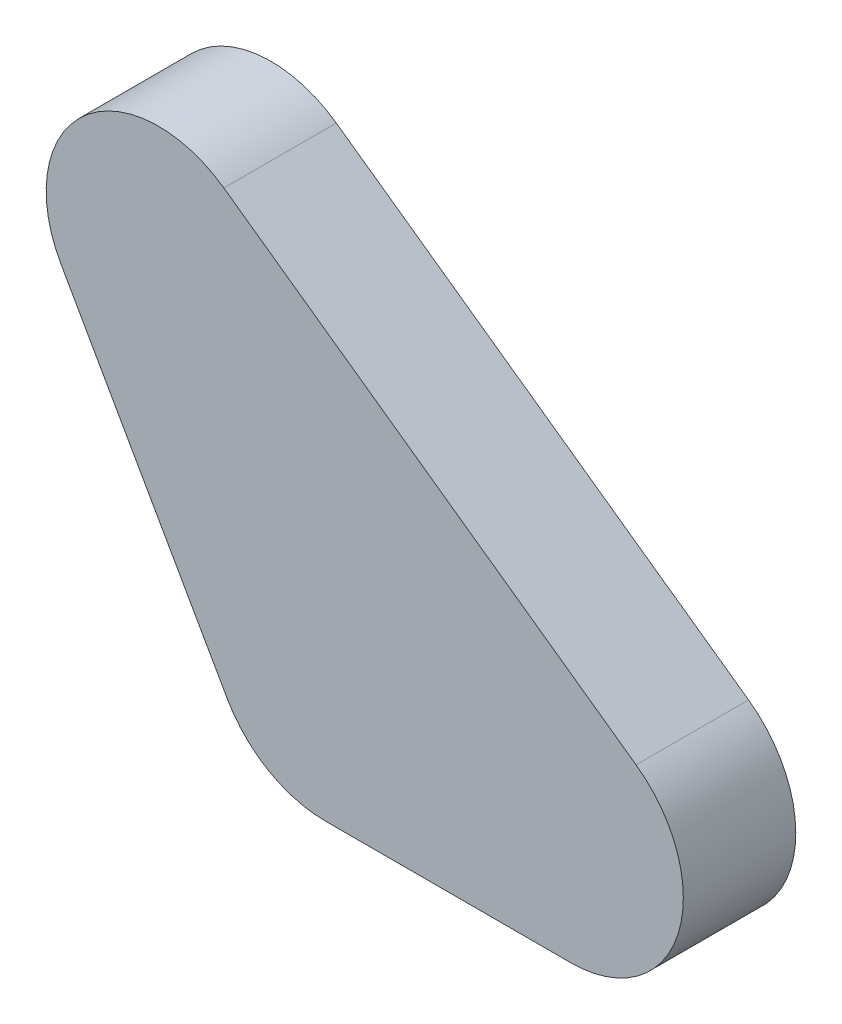
ISO-10303-21;
HEADER;
FILE_DESCRIPTION(('STEP AP214'),'2;1');
FILE_NAME('part.step','',(''),(''),'','','');
FILE_SCHEMA(('AUTOMOTIVE_DESIGN { 1 0 10303 214 1 1 1 1 }'));
ENDSEC;
DATA;
#1=APPLICATION_CONTEXT('core data for automotive mechanical design processes');
#2=APPLICATION_PROTOCOL_DEFINITION('international standard','automotive_design',2000,#1);
#3=PRODUCT_CONTEXT('',#1,'mechanical');
#4=PRODUCT('Part','Part','',(#3));
#5=PRODUCT_RELATED_PRODUCT_CATEGORY('part','',(#4));
#6=PRODUCT_DEFINITION_FORMATION('','',#4);
#7=PRODUCT_DEFINITION_CONTEXT('part definition',#1,'design');
#8=PRODUCT_DEFINITION('design','',#6,#7);
#9=PRODUCT_DEFINITION_SHAPE('','',#8);
#10=(LENGTH_UNIT() NAMED_UNIT(*) SI_UNIT(.MILLI.,.METRE.));
#11=(NAMED_UNIT(*) PLANE_ANGLE_UNIT() SI_UNIT($,.RADIAN.));
#12=(NAMED_UNIT(*) SI_UNIT($,.STERADIAN.) SOLID_ANGLE_UNIT());
#13=UNCERTAINTY_MEASURE_WITH_UNIT(LENGTH_MEASURE(1.E-05),#10,'distance_accuracy_value','');
#14=(GEOMETRIC_REPRESENTATION_CONTEXT(3) GLOBAL_UNCERTAINTY_ASSIGNED_CONTEXT((#13)) GLOBAL_UNIT_ASSIGNED_CONTEXT((#10,
#11,#12)) REPRESENTATION_CONTEXT('',''));
#15=CARTESIAN_POINT('',(0.,0.,0.));
#16=DIRECTION('',(0.,0.,1.));
#17=DIRECTION('',(1.,0.,0.));
#18=AXIS2_PLACEMENT_3D('',#15,#16,#17);
#19=CARTESIAN_POINT('',(36.6602369288858,-26.0964945599588,10.));
#20=DIRECTION('',(0.,0.,-1.));
#21=DIRECTION('',(-1.,0.,0.));
#22=AXIS2_PLACEMENT_3D('',#19,#20,#21);
#23=CYLINDRICAL_SURFACE('',#22,10.);
#24=CARTESIAN_POINT('',(36.6602369288858,-26.0964945599588,0.));
#25=DIRECTION('',(0.,0.,1.));
#26=DIRECTION('',(1.,0.,0.));
#27=AXIS2_PLACEMENT_3D('',#24,#25,#26);
#28=CIRCLE('',#27,10.);
#29=CARTESIAN_POINT('',(36.6602369288858,-36.0964945599588,0.));
#30=VERTEX_POINT('',#29);
#31=CARTESIAN_POINT('',(42.45945794221,-17.9497752424286,0.));
#32=VERTEX_POINT('',#31);
#33=EDGE_CURVE('E125',#30,#32,#28,.T.);
#34=ORIENTED_EDGE('',*,*,#33,.T.);
#35=DIRECTION('',(0.,0.,-1.));
#36=VECTOR('',#35,1.);
#37=CARTESIAN_POINT('',(42.45945794221,-17.9497752424286,10.));
#38=LINE('',#37,#36);
#39=CARTESIAN_POINT('',(42.45945794221,-17.9497752424286,10.));
#40=VERTEX_POINT('',#39);
#41=EDGE_CURVE('E11',#40,#32,#38,.T.);
#42=ORIENTED_EDGE('',*,*,#41,.F.);
#43=CARTESIAN_POINT('',(36.6602369288858,-26.0964945599588,10.));
#44=DIRECTION('',(0.,0.,1.));
#45=DIRECTION('',(1.,0.,0.));
#46=AXIS2_PLACEMENT_3D('',#43,#44,#45);
#47=CIRCLE('',#46,10.);
#48=CARTESIAN_POINT('',(36.6602369288858,-36.0964945599588,10.));
#49=VERTEX_POINT('',#48);
#50=EDGE_CURVE('E135',#49,#40,#47,.T.);
#51=ORIENTED_EDGE('',*,*,#50,.F.);
#52=DIRECTION('',(0.,0.,-1.));
#53=VECTOR('',#52,1.);
#54=CARTESIAN_POINT('',(36.6602369288858,-36.0964945599588,10.));
#55=LINE('',#54,#53);
#56=EDGE_CURVE('E121',#49,#30,#55,.T.);
#57=ORIENTED_EDGE('',*,*,#56,.T.);
#58=EDGE_LOOP('',(#34,#42,#51,#57));
#59=FACE_BOUND('',#58,.T.);
#60=ADVANCED_FACE('F41',(#59),#23,.T.);
#61=CARTESIAN_POINT('',(42.45945794221,-17.9497752424286,10.));
#62=DIRECTION('',(-0.579922101332417,-0.814671931753018,0.));
#63=DIRECTION('',(0.814671931753018,-0.579922101332417,0.));
#64=AXIS2_PLACEMENT_3D('',#61,#62,#63);
#65=PLANE('',#64);
#66=DIRECTION('',(-0.814671931753018,0.579922101332417,0.));
#67=VECTOR('',#66,1.);
#68=CARTESIAN_POINT('',(42.45945794221,-17.9497752424286,0.));
#69=LINE('',#68,#67);
#70=CARTESIAN_POINT('',(5.79922101332417,8.14671931753019,0.));
#71=VERTEX_POINT('',#70);
#72=EDGE_CURVE('E128',#32,#71,#69,.T.);
#73=ORIENTED_EDGE('',*,*,#72,.T.);
#74=DIRECTION('',(0.,0.,-1.));
#75=VECTOR('',#74,1.);
#76=CARTESIAN_POINT('',(5.79922101332417,8.14671931753019,10.));
#77=LINE('',#76,#75);
#78=CARTESIAN_POINT('',(5.79922101332417,8.14671931753019,10.));
#79=VERTEX_POINT('',#78);
#80=EDGE_CURVE('E49',#79,#71,#77,.T.);
#81=ORIENTED_EDGE('',*,*,#80,.F.);
#82=DIRECTION('',(-0.814671931753018,0.579922101332417,0.));
#83=VECTOR('',#82,1.);
#84=CARTESIAN_POINT('',(42.45945794221,-17.9497752424286,10.));
#85=LINE('',#84,#83);
#86=EDGE_CURVE('E94',#40,#79,#85,.T.);
#87=ORIENTED_EDGE('',*,*,#86,.F.);
#88=ORIENTED_EDGE('',*,*,#41,.T.);
#89=EDGE_LOOP('',(#73,#81,#87,#88));
#90=FACE_BOUND('',#89,.T.);
#91=ADVANCED_FACE('F159',(#90),#65,.F.);
#92=CARTESIAN_POINT('',(0.,0.,10.));
#93=DIRECTION('',(0.,0.,-1.));
#94=DIRECTION('',(-1.,0.,0.));
#95=AXIS2_PLACEMENT_3D('',#92,#93,#94);
#96=CYLINDRICAL_SURFACE('',#95,10.);
#97=CARTESIAN_POINT('',(0.,0.,0.));
#98=DIRECTION('',(0.,0.,1.));
#99=DIRECTION('',(1.,0.,0.));
#100=AXIS2_PLACEMENT_3D('',#97,#98,#99);
#101=CIRCLE('',#100,10.);
#102=CARTESIAN_POINT('',(-8.69883151998626,-4.9325784521783,0.));
#103=VERTEX_POINT('',#102);
#104=EDGE_CURVE('E130',#71,#103,#101,.T.);
#105=ORIENTED_EDGE('',*,*,#104,.T.);
#106=DIRECTION('',(0.,0.,-1.));
#107=VECTOR('',#106,1.);
#108=CARTESIAN_POINT('',(-8.69883151998626,-4.9325784521783,10.));
#109=LINE('',#108,#107);
#110=CARTESIAN_POINT('',(-8.69883151998626,-4.9325784521783,10.));
#111=VERTEX_POINT('',#110);
#112=EDGE_CURVE('E116',#111,#103,#109,.T.);
#113=ORIENTED_EDGE('',*,*,#112,.F.);
#114=CARTESIAN_POINT('',(0.,0.,10.));
#115=DIRECTION('',(0.,0.,1.));
#116=DIRECTION('',(1.,0.,0.));
#117=AXIS2_PLACEMENT_3D('',#114,#115,#116);
#118=CIRCLE('',#117,10.);
#119=EDGE_CURVE('E107',#79,#111,#118,.T.);
#120=ORIENTED_EDGE('',*,*,#119,.F.);
#121=ORIENTED_EDGE('',*,*,#80,.T.);
#122=EDGE_LOOP('',(#105,#113,#120,#121));
#123=FACE_BOUND('',#122,.T.);
#124=ADVANCED_FACE('F141',(#123),#96,.T.);
#125=CARTESIAN_POINT('',(6.09890383654862,-31.0290730121371,10.));
#126=DIRECTION('',(0.869883151998626,0.493257845217829,0.));
#127=DIRECTION('',(-0.493257845217829,0.869883151998626,0.));
#128=AXIS2_PLACEMENT_3D('',#125,#126,#127);
#129=PLANE('',#128);
#130=DIRECTION('',(0.493257845217829,-0.869883151998626,0.));
#131=VECTOR('',#130,1.);
#132=CARTESIAN_POINT('',(6.09890383654862,-31.0290730121371,0.));
#133=LINE('',#132,#131);
#134=CARTESIAN_POINT('',(6.09890383654862,-31.0290730121371,0.));
#135=VERTEX_POINT('',#134);
#136=EDGE_CURVE('E115',#103,#135,#133,.T.);
#137=ORIENTED_EDGE('',*,*,#136,.T.);
#138=DIRECTION('',(0.,0.,-1.));
#139=VECTOR('',#138,1.);
#140=CARTESIAN_POINT('',(6.09890383654862,-31.0290730121371,10.));
#141=LINE('',#140,#139);
#142=CARTESIAN_POINT('',(6.09890383654862,-31.0290730121371,10.));
#143=VERTEX_POINT('',#142);
#144=EDGE_CURVE('E112',#143,#135,#141,.T.);
#145=ORIENTED_EDGE('',*,*,#144,.F.);
#146=DIRECTION('',(0.493257845217829,-0.869883151998626,0.));
#147=VECTOR('',#146,1.);
#148=CARTESIAN_POINT('',(6.09890383654862,-31.0290730121371,10.));
#149=LINE('',#148,#147);
#150=EDGE_CURVE('E101',#111,#143,#149,.T.);
#151=ORIENTED_EDGE('',*,*,#150,.F.);
#152=ORIENTED_EDGE('',*,*,#112,.T.);
#153=EDGE_LOOP('',(#137,#145,#151,#152));
#154=FACE_BOUND('',#153,.T.);
#155=ADVANCED_FACE('F113',(#154),#129,.F.);
#156=CARTESIAN_POINT('',(14.7977353565349,-26.0964945599588,10.));
#157=DIRECTION('',(0.,0.,-1.));
#158=DIRECTION('',(-1.,0.,0.));
#159=AXIS2_PLACEMENT_3D('',#156,#157,#158);
#160=CYLINDRICAL_SURFACE('',#159,9.99999999999999);
#161=CARTESIAN_POINT('',(14.7977353565349,-26.0964945599588,0.));
#162=DIRECTION('',(0.,0.,1.));
#163=DIRECTION('',(-1.,0.,0.));
#164=AXIS2_PLACEMENT_3D('',#161,#162,#163);
#165=CIRCLE('',#164,9.99999999999999);
#166=CARTESIAN_POINT('',(14.7977353565349,-36.0964945599588,0.));
#167=VERTEX_POINT('',#166);
#168=EDGE_CURVE('E80',#135,#167,#165,.T.);
#169=ORIENTED_EDGE('',*,*,#168,.T.);
#170=DIRECTION('',(0.,0.,-1.));
#171=VECTOR('',#170,1.);
#172=CARTESIAN_POINT('',(14.7977353565349,-36.0964945599588,10.));
#173=LINE('',#172,#171);
#174=CARTESIAN_POINT('',(14.7977353565349,-36.0964945599588,10.));
#175=VERTEX_POINT('',#174);
#176=EDGE_CURVE('E117',#175,#167,#173,.T.);
#177=ORIENTED_EDGE('',*,*,#176,.F.);
#178=CARTESIAN_POINT('',(14.7977353565349,-26.0964945599588,10.));
#179=DIRECTION('',(0.,0.,1.));
#180=DIRECTION('',(-1.,0.,0.));
#181=AXIS2_PLACEMENT_3D('',#178,#179,#180);
#182=CIRCLE('',#181,9.99999999999999);
#183=EDGE_CURVE('E105',#143,#175,#182,.T.);
#184=ORIENTED_EDGE('',*,*,#183,.F.);
#185=ORIENTED_EDGE('',*,*,#144,.T.);
#186=EDGE_LOOP('',(#169,#177,#184,#185));
#187=FACE_BOUND('',#186,.T.);
#188=ADVANCED_FACE('F119',(#187),#160,.T.);
#189=CARTESIAN_POINT('',(14.7977353565349,-36.0964945599588,10.));
#190=DIRECTION('',(0.,1.,0.));
#191=DIRECTION('',(0.,0.,1.));
#192=AXIS2_PLACEMENT_3D('',#189,#190,#191);
#193=PLANE('',#192);
#194=DIRECTION('',(1.,0.,0.));
#195=VECTOR('',#194,1.);
#196=CARTESIAN_POINT('',(14.7977353565349,-36.0964945599588,0.));
#197=LINE('',#196,#195);
#198=EDGE_CURVE('E86',#167,#30,#197,.T.);
#199=ORIENTED_EDGE('',*,*,#198,.T.);
#200=ORIENTED_EDGE('',*,*,#56,.F.);
#201=DIRECTION('',(1.,0.,0.));
#202=VECTOR('',#201,1.);
#203=CARTESIAN_POINT('',(14.7977353565349,-36.0964945599588,10.));
#204=LINE('',#203,#202);
#205=EDGE_CURVE('E57',#175,#49,#204,.T.);
#206=ORIENTED_EDGE('',*,*,#205,.F.);
#207=ORIENTED_EDGE('',*,*,#176,.T.);
#208=EDGE_LOOP('',(#199,#200,#206,#207));
#209=FACE_BOUND('',#208,.T.);
#210=ADVANCED_FACE('F148',(#209),#193,.F.);
#211=CARTESIAN_POINT('',(36.6602369288858,-26.0964945599588,10.));
#212=DIRECTION('',(0.,0.,1.));
#213=DIRECTION('',(1.,0.,0.));
#214=AXIS2_PLACEMENT_3D('',#211,#212,#213);
#215=PLANE('',#214);
#216=ORIENTED_EDGE('',*,*,#50,.T.);
#217=ORIENTED_EDGE('',*,*,#86,.T.);
#218=ORIENTED_EDGE('',*,*,#119,.T.);
#219=ORIENTED_EDGE('',*,*,#150,.T.);
#220=ORIENTED_EDGE('',*,*,#183,.T.);
#221=ORIENTED_EDGE('',*,*,#205,.T.);
#222=EDGE_LOOP('',(#216,#217,#218,#219,#220,#221));
#223=FACE_BOUND('',#222,.T.);
#224=ADVANCED_FACE('F103',(#223),#215,.T.);
#225=CARTESIAN_POINT('',(36.6602369288858,-26.0964945599588,0.));
#226=DIRECTION('',(0.,0.,1.));
#227=DIRECTION('',(1.,0.,0.));
#228=AXIS2_PLACEMENT_3D('',#225,#226,#227);
#229=PLANE('',#228);
#230=ORIENTED_EDGE('',*,*,#33,.F.);
#231=ORIENTED_EDGE('',*,*,#198,.F.);
#232=ORIENTED_EDGE('',*,*,#168,.F.);
#233=ORIENTED_EDGE('',*,*,#136,.F.);
#234=ORIENTED_EDGE('',*,*,#104,.F.);
#235=ORIENTED_EDGE('',*,*,#72,.F.);
#236=EDGE_LOOP('',(#230,#231,#232,#233,#234,#235));
#237=FACE_BOUND('',#236,.T.);
#238=ADVANCED_FACE('F144',(#237),#229,.F.);
#239=CLOSED_SHELL('',(#60,#91,#124,#155,#188,#210,#224,#238));
#240=MANIFOLD_SOLID_BREP('B2',#239);
#241=ADVANCED_BREP_SHAPE_REPRESENTATION('',(#18,#240),#14);
#242=SHAPE_DEFINITION_REPRESENTATION(#9,#241);
ENDSEC;
END-ISO-10303-21;
